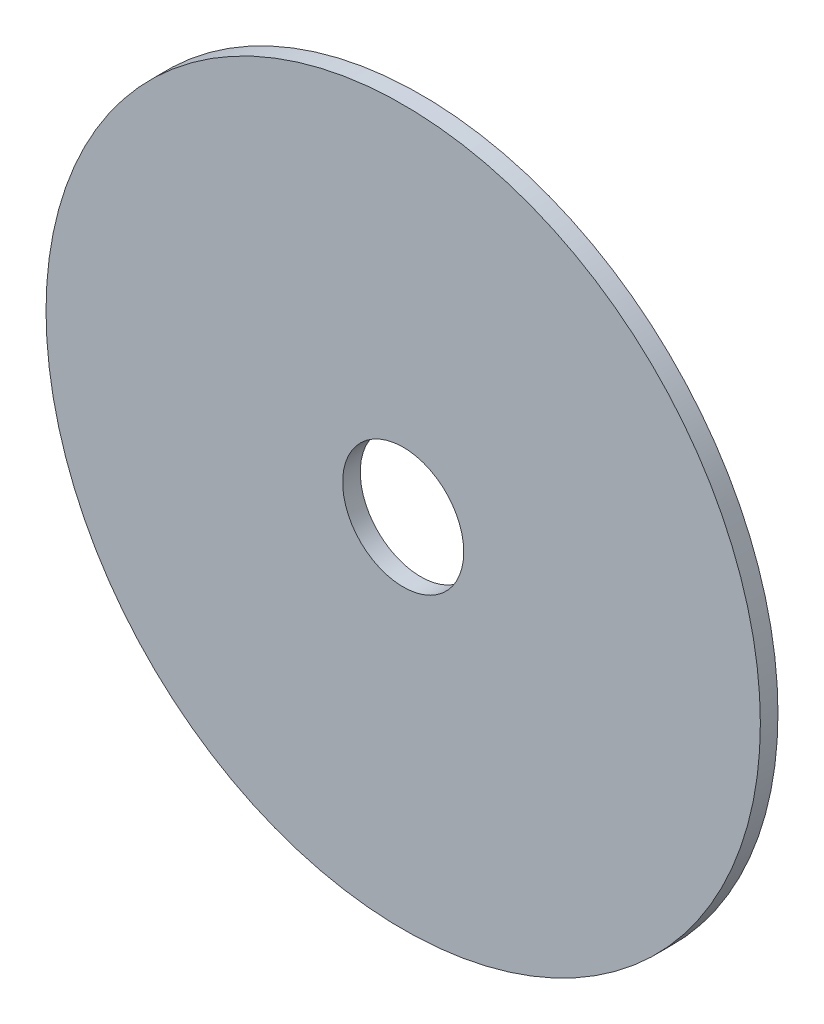
ISO-10303-21;
HEADER;
FILE_DESCRIPTION(('STEP AP214'),'2;1');
FILE_NAME('part.step','',(''),(''),'','','');
FILE_SCHEMA(('AUTOMOTIVE_DESIGN { 1 0 10303 214 1 1 1 1 }'));
ENDSEC;
DATA;
#1=APPLICATION_CONTEXT('core data for automotive mechanical design processes');
#2=APPLICATION_PROTOCOL_DEFINITION('international standard','automotive_design',2000,#1);
#3=PRODUCT_CONTEXT('',#1,'mechanical');
#4=PRODUCT('Part','Part','',(#3));
#5=PRODUCT_RELATED_PRODUCT_CATEGORY('part','',(#4));
#6=PRODUCT_DEFINITION_FORMATION('','',#4);
#7=PRODUCT_DEFINITION_CONTEXT('part definition',#1,'design');
#8=PRODUCT_DEFINITION('design','',#6,#7);
#9=PRODUCT_DEFINITION_SHAPE('','',#8);
#10=(LENGTH_UNIT() NAMED_UNIT(*) SI_UNIT(.MILLI.,.METRE.));
#11=(NAMED_UNIT(*) PLANE_ANGLE_UNIT() SI_UNIT($,.RADIAN.));
#12=(NAMED_UNIT(*) SI_UNIT($,.STERADIAN.) SOLID_ANGLE_UNIT());
#13=UNCERTAINTY_MEASURE_WITH_UNIT(LENGTH_MEASURE(1.E-05),#10,'distance_accuracy_value','');
#14=(GEOMETRIC_REPRESENTATION_CONTEXT(3) GLOBAL_UNCERTAINTY_ASSIGNED_CONTEXT((#13)) GLOBAL_UNIT_ASSIGNED_CONTEXT((#10,
#11,#12)) REPRESENTATION_CONTEXT('',''));
#15=CARTESIAN_POINT('',(0.,0.,0.));
#16=DIRECTION('',(0.,0.,1.));
#17=DIRECTION('',(1.,0.,0.));
#18=AXIS2_PLACEMENT_3D('',#15,#16,#17);
#19=CARTESIAN_POINT('',(0.,0.,3.175));
#20=DIRECTION('',(0.,0.,-1.));
#21=DIRECTION('',(-1.,0.,0.));
#22=AXIS2_PLACEMENT_3D('',#19,#20,#21);
#23=CYLINDRICAL_SURFACE('',#22,10.9163147014637);
#24=CARTESIAN_POINT('',(0.,0.,3.175));
#25=DIRECTION('',(0.,0.,1.));
#26=DIRECTION('',(1.,0.,0.));
#27=AXIS2_PLACEMENT_3D('',#24,#25,#26);
#28=CIRCLE('',#27,10.9163147014637);
#29=CARTESIAN_POINT('',(10.9163147014637,0.,3.175));
#30=VERTEX_POINT('',#29);
#31=EDGE_CURVE('E39',#30,#30,#28,.T.);
#32=ORIENTED_EDGE('',*,*,#31,.T.);
#33=EDGE_LOOP('',(#32));
#34=FACE_BOUND('',#33,.T.);
#35=CARTESIAN_POINT('',(0.,0.,0.));
#36=DIRECTION('',(0.,0.,1.));
#37=DIRECTION('',(1.,0.,0.));
#38=AXIS2_PLACEMENT_3D('',#35,#36,#37);
#39=CIRCLE('',#38,10.9163147014637);
#40=CARTESIAN_POINT('',(10.9163147014637,0.,0.));
#41=VERTEX_POINT('',#40);
#42=EDGE_CURVE('E45',#41,#41,#39,.T.);
#43=ORIENTED_EDGE('',*,*,#42,.F.);
#44=EDGE_LOOP('',(#43));
#45=FACE_BOUND('',#44,.T.);
#46=ADVANCED_FACE('F32',(#34,#45),#23,.F.);
#47=CARTESIAN_POINT('',(0.,0.,3.175));
#48=DIRECTION('',(0.,0.,-1.));
#49=DIRECTION('',(-1.,0.,0.));
#50=AXIS2_PLACEMENT_3D('',#47,#48,#49);
#51=CYLINDRICAL_SURFACE('',#50,64.39);
#52=CARTESIAN_POINT('',(0.,0.,3.175));
#53=DIRECTION('',(0.,0.,1.));
#54=DIRECTION('',(1.,0.,0.));
#55=AXIS2_PLACEMENT_3D('',#52,#53,#54);
#56=CIRCLE('',#55,64.39);
#57=CARTESIAN_POINT('',(64.39,0.,3.175));
#58=VERTEX_POINT('',#57);
#59=EDGE_CURVE('E10',#58,#58,#56,.T.);
#60=ORIENTED_EDGE('',*,*,#59,.F.);
#61=EDGE_LOOP('',(#60));
#62=FACE_BOUND('',#61,.T.);
#63=CARTESIAN_POINT('',(0.,0.,0.));
#64=DIRECTION('',(0.,0.,1.));
#65=DIRECTION('',(1.,0.,0.));
#66=AXIS2_PLACEMENT_3D('',#63,#64,#65);
#67=CIRCLE('',#66,64.39);
#68=CARTESIAN_POINT('',(64.39,0.,0.));
#69=VERTEX_POINT('',#68);
#70=EDGE_CURVE('E35',#69,#69,#67,.T.);
#71=ORIENTED_EDGE('',*,*,#70,.T.);
#72=EDGE_LOOP('',(#71));
#73=FACE_BOUND('',#72,.T.);
#74=ADVANCED_FACE('F52',(#62,#73),#51,.T.);
#75=CARTESIAN_POINT('',(0.,0.,3.175));
#76=DIRECTION('',(0.,0.,1.));
#77=DIRECTION('',(1.,0.,0.));
#78=AXIS2_PLACEMENT_3D('',#75,#76,#77);
#79=PLANE('',#78);
#80=ORIENTED_EDGE('',*,*,#31,.F.);
#81=EDGE_LOOP('',(#80));
#82=FACE_BOUND('',#81,.T.);
#83=ORIENTED_EDGE('',*,*,#59,.T.);
#84=EDGE_LOOP('',(#83));
#85=FACE_BOUND('',#84,.T.);
#86=ADVANCED_FACE('F56',(#82,#85),#79,.T.);
#87=CARTESIAN_POINT('',(0.,0.,0.));
#88=DIRECTION('',(0.,0.,1.));
#89=DIRECTION('',(1.,0.,0.));
#90=AXIS2_PLACEMENT_3D('',#87,#88,#89);
#91=PLANE('',#90);
#92=ORIENTED_EDGE('',*,*,#42,.T.);
#93=EDGE_LOOP('',(#92));
#94=FACE_BOUND('',#93,.T.);
#95=ORIENTED_EDGE('',*,*,#70,.F.);
#96=EDGE_LOOP('',(#95));
#97=FACE_BOUND('',#96,.T.);
#98=ADVANCED_FACE('F54',(#94,#97),#91,.F.);
#99=CLOSED_SHELL('',(#46,#74,#86,#98));
#100=MANIFOLD_SOLID_BREP('B2',#99);
#101=ADVANCED_BREP_SHAPE_REPRESENTATION('',(#18,#100),#14);
#102=SHAPE_DEFINITION_REPRESENTATION(#9,#101);
ENDSEC;
END-ISO-10303-21;
